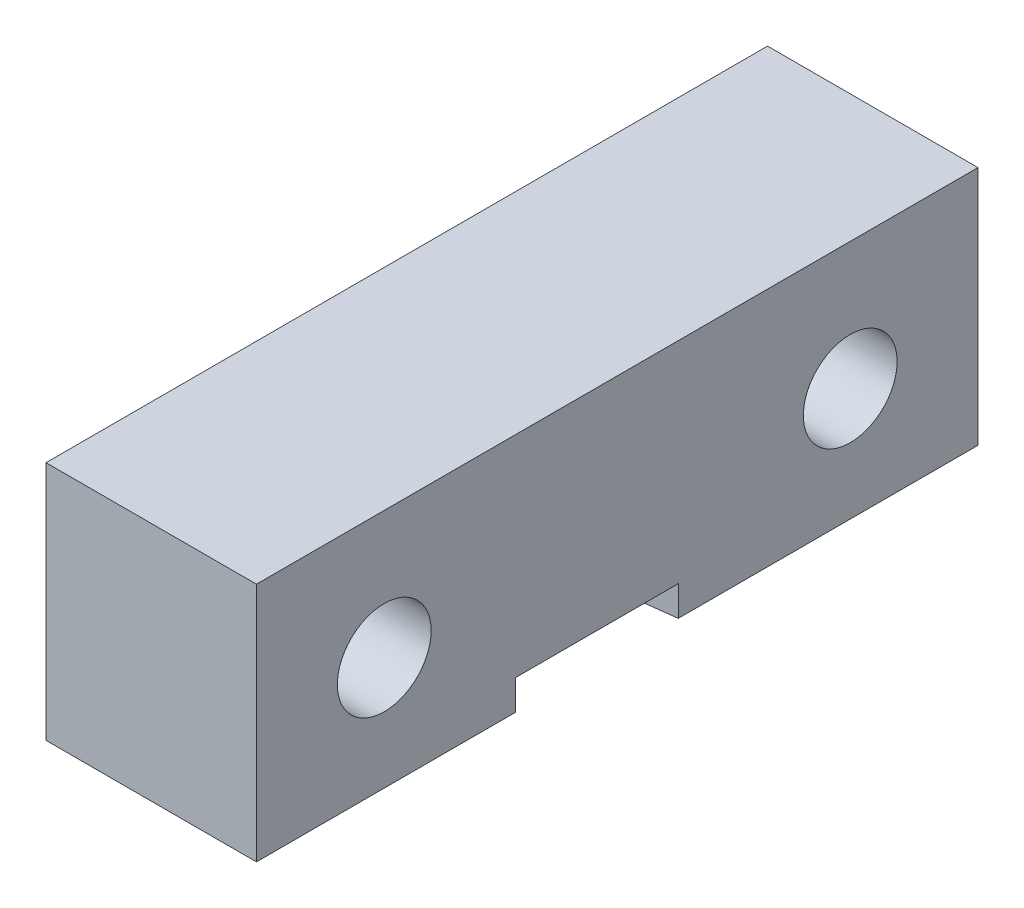
ISO-10303-21;
HEADER;
FILE_DESCRIPTION(('STEP AP214'),'2;1');
FILE_NAME('part.step','',(''),(''),'','','');
FILE_SCHEMA(('AUTOMOTIVE_DESIGN { 1 0 10303 214 1 1 1 1 }'));
ENDSEC;
DATA;
#1=APPLICATION_CONTEXT('core data for automotive mechanical design processes');
#2=APPLICATION_PROTOCOL_DEFINITION('international standard','automotive_design',2000,#1);
#3=PRODUCT_CONTEXT('',#1,'mechanical');
#4=PRODUCT('Part','Part','',(#3));
#5=PRODUCT_RELATED_PRODUCT_CATEGORY('part','',(#4));
#6=PRODUCT_DEFINITION_FORMATION('','',#4);
#7=PRODUCT_DEFINITION_CONTEXT('part definition',#1,'design');
#8=PRODUCT_DEFINITION('design','',#6,#7);
#9=PRODUCT_DEFINITION_SHAPE('','',#8);
#10=(LENGTH_UNIT() NAMED_UNIT(*) SI_UNIT(.MILLI.,.METRE.));
#11=(NAMED_UNIT(*) PLANE_ANGLE_UNIT() SI_UNIT($,.RADIAN.));
#12=(NAMED_UNIT(*) SI_UNIT($,.STERADIAN.) SOLID_ANGLE_UNIT());
#13=UNCERTAINTY_MEASURE_WITH_UNIT(LENGTH_MEASURE(1.E-05),#10,'distance_accuracy_value','');
#14=(GEOMETRIC_REPRESENTATION_CONTEXT(3) GLOBAL_UNCERTAINTY_ASSIGNED_CONTEXT((#13)) GLOBAL_UNIT_ASSIGNED_CONTEXT((#10,
#11,#12)) REPRESENTATION_CONTEXT('',''));
#15=CARTESIAN_POINT('',(0.,0.,0.));
#16=DIRECTION('',(0.,0.,1.));
#17=DIRECTION('',(1.,0.,0.));
#18=AXIS2_PLACEMENT_3D('',#15,#16,#17);
#19=CARTESIAN_POINT('',(-22.226,-1.52399999999999,-49.2125));
#20=DIRECTION('',(1.,0.,0.));
#21=DIRECTION('',(0.,0.,-1.));
#22=AXIS2_PLACEMENT_3D('',#19,#20,#21);
#23=CYLINDRICAL_SURFACE('',#22,6.731);
#24=CARTESIAN_POINT('',(-22.225,-1.52399999999999,-49.2125));
#25=DIRECTION('',(1.,0.,0.));
#26=DIRECTION('',(0.,0.,-1.));
#27=AXIS2_PLACEMENT_3D('',#24,#25,#26);
#28=CIRCLE('',#27,6.731);
#29=CARTESIAN_POINT('',(-22.225,-1.52399999999999,-55.9435));
#30=VERTEX_POINT('',#29);
#31=EDGE_CURVE('E162',#30,#30,#28,.F.);
#32=ORIENTED_EDGE('',*,*,#31,.T.);
#33=EDGE_LOOP('',(#32));
#34=FACE_BOUND('',#33,.T.);
#35=CARTESIAN_POINT('',(-16.383,-1.52399999999999,-49.2125));
#36=DIRECTION('',(1.,0.,0.));
#37=DIRECTION('',(0.,0.,-1.));
#38=AXIS2_PLACEMENT_3D('',#35,#36,#37);
#39=CIRCLE('',#38,6.731);
#40=CARTESIAN_POINT('',(-16.383,-1.52399999999999,-55.9435));
#41=VERTEX_POINT('',#40);
#42=EDGE_CURVE('E46',#41,#41,#39,.F.);
#43=ORIENTED_EDGE('',*,*,#42,.F.);
#44=EDGE_LOOP('',(#43));
#45=FACE_BOUND('',#44,.T.);
#46=ADVANCED_FACE('F42',(#34,#45),#23,.F.);
#47=CARTESIAN_POINT('',(-22.226,-1.52399999999999,49.2125));
#48=DIRECTION('',(1.,0.,0.));
#49=DIRECTION('',(0.,0.,-1.));
#50=AXIS2_PLACEMENT_3D('',#47,#48,#49);
#51=CYLINDRICAL_SURFACE('',#50,6.731);
#52=CARTESIAN_POINT('',(-22.225,-1.52399999999999,49.2125));
#53=DIRECTION('',(1.,0.,0.));
#54=DIRECTION('',(0.,0.,-1.));
#55=AXIS2_PLACEMENT_3D('',#52,#53,#54);
#56=CIRCLE('',#55,6.731);
#57=CARTESIAN_POINT('',(-22.225,-1.52399999999999,42.4815));
#58=VERTEX_POINT('',#57);
#59=EDGE_CURVE('E158',#58,#58,#56,.F.);
#60=ORIENTED_EDGE('',*,*,#59,.T.);
#61=EDGE_LOOP('',(#60));
#62=FACE_BOUND('',#61,.T.);
#63=CARTESIAN_POINT('',(-16.383,-1.52399999999999,49.2125));
#64=DIRECTION('',(1.,0.,0.));
#65=DIRECTION('',(0.,0.,-1.));
#66=AXIS2_PLACEMENT_3D('',#63,#64,#65);
#67=CIRCLE('',#66,6.731);
#68=CARTESIAN_POINT('',(-16.383,-1.52399999999999,42.4815));
#69=VERTEX_POINT('',#68);
#70=EDGE_CURVE('E148',#69,#69,#67,.F.);
#71=ORIENTED_EDGE('',*,*,#70,.F.);
#72=EDGE_LOOP('',(#71));
#73=FACE_BOUND('',#72,.T.);
#74=ADVANCED_FACE('F193',(#62,#73),#51,.F.);
#75=CARTESIAN_POINT('',(-22.225,-25.4,76.2));
#76=DIRECTION('',(1.,0.,0.));
#77=DIRECTION('',(0.,0.,-1.));
#78=AXIS2_PLACEMENT_3D('',#75,#76,#77);
#79=PLANE('',#78);
#80=ORIENTED_EDGE('',*,*,#59,.F.);
#81=EDGE_LOOP('',(#80));
#82=FACE_BOUND('',#81,.T.);
#83=ORIENTED_EDGE('',*,*,#31,.F.);
#84=EDGE_LOOP('',(#83));
#85=FACE_BOUND('',#84,.T.);
#86=DIRECTION('',(0.,-1.,0.));
#87=VECTOR('',#86,1.);
#88=CARTESIAN_POINT('',(-22.225,-25.4,-76.2));
#89=LINE('',#88,#87);
#90=CARTESIAN_POINT('',(-22.225,25.4,-76.2));
#91=VERTEX_POINT('',#90);
#92=CARTESIAN_POINT('',(-22.225,-25.4,-76.2));
#93=VERTEX_POINT('',#92);
#94=EDGE_CURVE('E161',#91,#93,#89,.T.);
#95=ORIENTED_EDGE('',*,*,#94,.T.);
#96=DIRECTION('',(0.,0.,-1.));
#97=VECTOR('',#96,1.);
#98=CARTESIAN_POINT('',(-22.225,-25.4,76.2));
#99=LINE('',#98,#97);
#100=CARTESIAN_POINT('',(-22.225,-25.4,76.2));
#101=VERTEX_POINT('',#100);
#102=EDGE_CURVE('E11',#101,#93,#99,.T.);
#103=ORIENTED_EDGE('',*,*,#102,.F.);
#104=DIRECTION('',(0.,-1.,0.));
#105=VECTOR('',#104,1.);
#106=CARTESIAN_POINT('',(-22.225,-25.4,76.2));
#107=LINE('',#106,#105);
#108=CARTESIAN_POINT('',(-22.225,25.4,76.2));
#109=VERTEX_POINT('',#108);
#110=EDGE_CURVE('E165',#109,#101,#107,.T.);
#111=ORIENTED_EDGE('',*,*,#110,.F.);
#112=DIRECTION('',(0.,0.,-1.));
#113=VECTOR('',#112,1.);
#114=CARTESIAN_POINT('',(-22.225,25.4,76.2));
#115=LINE('',#114,#113);
#116=EDGE_CURVE('E171',#109,#91,#115,.T.);
#117=ORIENTED_EDGE('',*,*,#116,.T.);
#118=EDGE_LOOP('',(#95,#103,#111,#117));
#119=FACE_BOUND('',#118,.T.);
#120=ADVANCED_FACE('F44',(#82,#85,#119),#79,.F.);
#121=CARTESIAN_POINT('',(22.225,-25.4,76.2));
#122=DIRECTION('',(0.,1.,0.));
#123=DIRECTION('',(-1.,0.,0.));
#124=AXIS2_PLACEMENT_3D('',#121,#122,#123);
#125=PLANE('',#124);
#126=DIRECTION('',(0.,0.,-1.));
#127=VECTOR('',#126,1.);
#128=CARTESIAN_POINT('',(22.225,-25.4,76.2));
#129=LINE('',#128,#127);
#130=CARTESIAN_POINT('',(22.225,-25.4,-12.8902412442228));
#131=VERTEX_POINT('',#130);
#132=CARTESIAN_POINT('',(22.225,-25.4,-76.2));
#133=VERTEX_POINT('',#132);
#134=EDGE_CURVE('E183',#131,#133,#129,.T.);
#135=ORIENTED_EDGE('',*,*,#134,.F.);
#136=DIRECTION('',(0.992381216435197,0.,-0.123205199835875));
#137=VECTOR('',#136,1.);
#138=CARTESIAN_POINT('',(22.225,-25.4,-12.8902412442228));
#139=LINE('',#138,#137);
#140=CARTESIAN_POINT('',(0.94724636356612,-25.4,-10.248585149348));
#141=VERTEX_POINT('',#140);
#142=EDGE_CURVE('E226',#141,#131,#139,.T.);
#143=ORIENTED_EDGE('',*,*,#142,.F.);
#144=CARTESIAN_POINT('',(2.75604654339657,-25.4,4.32076196538043));
#145=DIRECTION('',(0.,-1.,0.));
#146=DIRECTION('',(1.,0.,0.));
#147=AXIS2_PLACEMENT_3D('',#144,#145,#146);
#148=CIRCLE('',#147,14.6812);
#149=CARTESIAN_POINT('',(0.947246363566016,-25.4,18.8901090801088));
#150=VERTEX_POINT('',#149);
#151=EDGE_CURVE('E234',#150,#141,#148,.T.);
#152=ORIENTED_EDGE('',*,*,#151,.F.);
#153=DIRECTION('',(-0.992381216435197,0.,-0.123205199835882));
#154=VECTOR('',#153,1.);
#155=CARTESIAN_POINT('',(22.225,-25.4,21.5317651749838));
#156=LINE('',#155,#154);
#157=CARTESIAN_POINT('',(22.225,-25.4,21.5317651749838));
#158=VERTEX_POINT('',#157);
#159=EDGE_CURVE('E232',#158,#150,#156,.T.);
#160=ORIENTED_EDGE('',*,*,#159,.F.);
#161=CARTESIAN_POINT('',(22.225,-25.4,76.2));
#162=VERTEX_POINT('',#161);
#163=EDGE_CURVE('E51',#162,#158,#129,.T.);
#164=ORIENTED_EDGE('',*,*,#163,.F.);
#165=DIRECTION('',(1.,0.,0.));
#166=VECTOR('',#165,1.);
#167=CARTESIAN_POINT('',(22.225,-25.4,76.2));
#168=LINE('',#167,#166);
#169=EDGE_CURVE('E96',#101,#162,#168,.T.);
#170=ORIENTED_EDGE('',*,*,#169,.F.);
#171=ORIENTED_EDGE('',*,*,#102,.T.);
#172=DIRECTION('',(1.,0.,0.));
#173=VECTOR('',#172,1.);
#174=CARTESIAN_POINT('',(22.225,-25.4,-76.2));
#175=LINE('',#174,#173);
#176=EDGE_CURVE('E174',#93,#133,#175,.T.);
#177=ORIENTED_EDGE('',*,*,#176,.T.);
#178=EDGE_LOOP('',(#135,#143,#152,#160,#164,#170,#171,#177));
#179=FACE_BOUND('',#178,.T.);
#180=ADVANCED_FACE('F215',(#179),#125,.F.);
#181=CARTESIAN_POINT('',(22.225,-25.4,76.2));
#182=DIRECTION('',(-1.,0.,0.));
#183=DIRECTION('',(0.,0.,1.));
#184=AXIS2_PLACEMENT_3D('',#181,#182,#183);
#185=PLANE('',#184);
#186=CARTESIAN_POINT('',(22.225,-1.52399999999999,49.2125));
#187=DIRECTION('',(1.,0.,0.));
#188=DIRECTION('',(0.,0.,-1.));
#189=AXIS2_PLACEMENT_3D('',#186,#187,#188);
#190=CIRCLE('',#189,9.906);
#191=CARTESIAN_POINT('',(22.225,-1.52399999999999,39.3065));
#192=VERTEX_POINT('',#191);
#193=EDGE_CURVE('E149',#192,#192,#190,.T.);
#194=ORIENTED_EDGE('',*,*,#193,.F.);
#195=EDGE_LOOP('',(#194));
#196=FACE_BOUND('',#195,.T.);
#197=CARTESIAN_POINT('',(22.225,-1.52399999999999,-49.2125));
#198=DIRECTION('',(1.,0.,0.));
#199=DIRECTION('',(0.,0.,-1.));
#200=AXIS2_PLACEMENT_3D('',#197,#198,#199);
#201=CIRCLE('',#200,9.906);
#202=CARTESIAN_POINT('',(22.225,-1.52399999999999,-59.1185));
#203=VERTEX_POINT('',#202);
#204=EDGE_CURVE('E152',#203,#203,#201,.T.);
#205=ORIENTED_EDGE('',*,*,#204,.F.);
#206=EDGE_LOOP('',(#205));
#207=FACE_BOUND('',#206,.T.);
#208=DIRECTION('',(0.,0.,1.));
#209=VECTOR('',#208,1.);
#210=CARTESIAN_POINT('',(22.225,-19.05,-12.8902412442228));
#211=LINE('',#210,#209);
#212=CARTESIAN_POINT('',(22.225,-19.05,-12.8902412442228));
#213=VERTEX_POINT('',#212);
#214=CARTESIAN_POINT('',(22.225,-19.05,21.5317651749838));
#215=VERTEX_POINT('',#214);
#216=EDGE_CURVE('E128',#213,#215,#211,.T.);
#217=ORIENTED_EDGE('',*,*,#216,.F.);
#218=DIRECTION('',(0.,-1.,0.));
#219=VECTOR('',#218,1.);
#220=CARTESIAN_POINT('',(22.225,-19.05,-12.8902412442228));
#221=LINE('',#220,#219);
#222=EDGE_CURVE('E138',#213,#131,#221,.T.);
#223=ORIENTED_EDGE('',*,*,#222,.T.);
#224=ORIENTED_EDGE('',*,*,#134,.T.);
#225=DIRECTION('',(0.,1.,0.));
#226=VECTOR('',#225,1.);
#227=CARTESIAN_POINT('',(22.225,-25.4,-76.2));
#228=LINE('',#227,#226);
#229=CARTESIAN_POINT('',(22.225,25.4,-76.2));
#230=VERTEX_POINT('',#229);
#231=EDGE_CURVE('E177',#133,#230,#228,.T.);
#232=ORIENTED_EDGE('',*,*,#231,.T.);
#233=DIRECTION('',(0.,0.,-1.));
#234=VECTOR('',#233,1.);
#235=CARTESIAN_POINT('',(22.225,25.4,76.2));
#236=LINE('',#235,#234);
#237=CARTESIAN_POINT('',(22.225,25.4,76.2));
#238=VERTEX_POINT('',#237);
#239=EDGE_CURVE('E181',#238,#230,#236,.T.);
#240=ORIENTED_EDGE('',*,*,#239,.F.);
#241=DIRECTION('',(0.,1.,0.));
#242=VECTOR('',#241,1.);
#243=CARTESIAN_POINT('',(22.225,-25.4,76.2));
#244=LINE('',#243,#242);
#245=EDGE_CURVE('E168',#162,#238,#244,.T.);
#246=ORIENTED_EDGE('',*,*,#245,.F.);
#247=ORIENTED_EDGE('',*,*,#163,.T.);
#248=DIRECTION('',(0.,-1.,0.));
#249=VECTOR('',#248,1.);
#250=CARTESIAN_POINT('',(22.225,-19.05,21.5317651749838));
#251=LINE('',#250,#249);
#252=EDGE_CURVE('E123',#215,#158,#251,.T.);
#253=ORIENTED_EDGE('',*,*,#252,.F.);
#254=EDGE_LOOP('',(#217,#223,#224,#232,#240,#246,#247,#253));
#255=FACE_BOUND('',#254,.T.);
#256=ADVANCED_FACE('F136',(#196,#207,#255),#185,.F.);
#257=CARTESIAN_POINT('',(22.225,25.4,76.2));
#258=DIRECTION('',(0.,-1.,0.));
#259=DIRECTION('',(1.,0.,0.));
#260=AXIS2_PLACEMENT_3D('',#257,#258,#259);
#261=PLANE('',#260);
#262=DIRECTION('',(-1.,0.,0.));
#263=VECTOR('',#262,1.);
#264=CARTESIAN_POINT('',(22.225,25.4,-76.2));
#265=LINE('',#264,#263);
#266=EDGE_CURVE('E89',#230,#91,#265,.T.);
#267=ORIENTED_EDGE('',*,*,#266,.T.);
#268=ORIENTED_EDGE('',*,*,#116,.F.);
#269=DIRECTION('',(-1.,0.,0.));
#270=VECTOR('',#269,1.);
#271=CARTESIAN_POINT('',(22.225,25.4,76.2));
#272=LINE('',#271,#270);
#273=EDGE_CURVE('E68',#238,#109,#272,.T.);
#274=ORIENTED_EDGE('',*,*,#273,.F.);
#275=ORIENTED_EDGE('',*,*,#239,.T.);
#276=EDGE_LOOP('',(#267,#268,#274,#275));
#277=FACE_BOUND('',#276,.T.);
#278=ADVANCED_FACE('F207',(#277),#261,.F.);
#279=CARTESIAN_POINT('',(0.,0.,76.2));
#280=DIRECTION('',(0.,0.,1.));
#281=DIRECTION('',(1.,0.,0.));
#282=AXIS2_PLACEMENT_3D('',#279,#280,#281);
#283=PLANE('',#282);
#284=ORIENTED_EDGE('',*,*,#110,.T.);
#285=ORIENTED_EDGE('',*,*,#169,.T.);
#286=ORIENTED_EDGE('',*,*,#245,.T.);
#287=ORIENTED_EDGE('',*,*,#273,.T.);
#288=EDGE_LOOP('',(#284,#285,#286,#287));
#289=FACE_BOUND('',#288,.T.);
#290=ADVANCED_FACE('F203',(#289),#283,.T.);
#291=CARTESIAN_POINT('',(0.,0.,-76.2));
#292=DIRECTION('',(0.,0.,1.));
#293=DIRECTION('',(1.,0.,0.));
#294=AXIS2_PLACEMENT_3D('',#291,#292,#293);
#295=PLANE('',#294);
#296=ORIENTED_EDGE('',*,*,#94,.F.);
#297=ORIENTED_EDGE('',*,*,#266,.F.);
#298=ORIENTED_EDGE('',*,*,#231,.F.);
#299=ORIENTED_EDGE('',*,*,#176,.F.);
#300=EDGE_LOOP('',(#296,#297,#298,#299));
#301=FACE_BOUND('',#300,.T.);
#302=ADVANCED_FACE('F206',(#301),#295,.F.);
#303=CARTESIAN_POINT('',(-16.383,-1.52399999999999,49.2125));
#304=DIRECTION('',(1.,0.,0.));
#305=DIRECTION('',(0.,0.,-1.));
#306=AXIS2_PLACEMENT_3D('',#303,#304,#305);
#307=PLANE('',#306);
#308=CARTESIAN_POINT('',(-16.383,-1.52399999999999,49.2125));
#309=DIRECTION('',(1.,0.,0.));
#310=DIRECTION('',(0.,0.,-1.));
#311=AXIS2_PLACEMENT_3D('',#308,#309,#310);
#312=CIRCLE('',#311,9.906);
#313=CARTESIAN_POINT('',(-16.383,-1.52399999999999,39.3065));
#314=VERTEX_POINT('',#313);
#315=EDGE_CURVE('E145',#314,#314,#312,.T.);
#316=ORIENTED_EDGE('',*,*,#315,.T.);
#317=EDGE_LOOP('',(#316));
#318=FACE_BOUND('',#317,.T.);
#319=ORIENTED_EDGE('',*,*,#70,.T.);
#320=EDGE_LOOP('',(#319));
#321=FACE_BOUND('',#320,.T.);
#322=ADVANCED_FACE('F210',(#318,#321),#307,.T.);
#323=CARTESIAN_POINT('',(-16.383,-1.52399999999999,49.2125));
#324=DIRECTION('',(1.,0.,0.));
#325=DIRECTION('',(0.,0.,-1.));
#326=AXIS2_PLACEMENT_3D('',#323,#324,#325);
#327=CYLINDRICAL_SURFACE('',#326,9.906);
#328=ORIENTED_EDGE('',*,*,#315,.F.);
#329=EDGE_LOOP('',(#328));
#330=FACE_BOUND('',#329,.T.);
#331=ORIENTED_EDGE('',*,*,#193,.T.);
#332=EDGE_LOOP('',(#331));
#333=FACE_BOUND('',#332,.T.);
#334=ADVANCED_FACE('F258',(#330,#333),#327,.F.);
#335=CARTESIAN_POINT('',(-16.383,-1.52399999999999,-49.2125));
#336=DIRECTION('',(1.,0.,0.));
#337=DIRECTION('',(0.,0.,-1.));
#338=AXIS2_PLACEMENT_3D('',#335,#336,#337);
#339=PLANE('',#338);
#340=CARTESIAN_POINT('',(-16.383,-1.52399999999999,-49.2125));
#341=DIRECTION('',(1.,0.,0.));
#342=DIRECTION('',(0.,0.,-1.));
#343=AXIS2_PLACEMENT_3D('',#340,#341,#342);
#344=CIRCLE('',#343,9.906);
#345=CARTESIAN_POINT('',(-16.383,-1.52399999999999,-59.1185));
#346=VERTEX_POINT('',#345);
#347=EDGE_CURVE('E155',#346,#346,#344,.T.);
#348=ORIENTED_EDGE('',*,*,#347,.T.);
#349=EDGE_LOOP('',(#348));
#350=FACE_BOUND('',#349,.T.);
#351=ORIENTED_EDGE('',*,*,#42,.T.);
#352=EDGE_LOOP('',(#351));
#353=FACE_BOUND('',#352,.T.);
#354=ADVANCED_FACE('F190',(#350,#353),#339,.T.);
#355=CARTESIAN_POINT('',(-16.383,-1.52399999999999,-49.2125));
#356=DIRECTION('',(1.,0.,0.));
#357=DIRECTION('',(0.,0.,-1.));
#358=AXIS2_PLACEMENT_3D('',#355,#356,#357);
#359=CYLINDRICAL_SURFACE('',#358,9.906);
#360=ORIENTED_EDGE('',*,*,#347,.F.);
#361=EDGE_LOOP('',(#360));
#362=FACE_BOUND('',#361,.T.);
#363=ORIENTED_EDGE('',*,*,#204,.T.);
#364=EDGE_LOOP('',(#363));
#365=FACE_BOUND('',#364,.T.);
#366=ADVANCED_FACE('F252',(#362,#365),#359,.F.);
#367=CARTESIAN_POINT('',(22.225,-19.05,-12.8902412442228));
#368=DIRECTION('',(-0.123205199835875,0.,-0.992381216435197));
#369=DIRECTION('',(-0.992381216435198,0.,0.123205199835875));
#370=AXIS2_PLACEMENT_3D('',#367,#368,#369);
#371=PLANE('',#370);
#372=ORIENTED_EDGE('',*,*,#142,.T.);
#373=ORIENTED_EDGE('',*,*,#222,.F.);
#374=DIRECTION('',(0.992381216435197,0.,-0.123205199835875));
#375=VECTOR('',#374,1.);
#376=CARTESIAN_POINT('',(22.225,-19.05,-12.8902412442228));
#377=LINE('',#376,#375);
#378=CARTESIAN_POINT('',(0.947246363566119,-19.05,-10.248585149348));
#379=VERTEX_POINT('',#378);
#380=EDGE_CURVE('E59',#379,#213,#377,.T.);
#381=ORIENTED_EDGE('',*,*,#380,.F.);
#382=DIRECTION('',(0.,-1.,0.));
#383=VECTOR('',#382,1.);
#384=CARTESIAN_POINT('',(0.947246363566119,-19.05,-10.248585149348));
#385=LINE('',#384,#383);
#386=EDGE_CURVE('E140',#379,#141,#385,.T.);
#387=ORIENTED_EDGE('',*,*,#386,.T.);
#388=EDGE_LOOP('',(#372,#373,#381,#387));
#389=FACE_BOUND('',#388,.T.);
#390=ADVANCED_FACE('F230',(#389),#371,.F.);
#391=CARTESIAN_POINT('',(2.75604654339657,-19.05,4.32076196538043));
#392=DIRECTION('',(0.,-1.,0.));
#393=DIRECTION('',(1.,0.,0.));
#394=AXIS2_PLACEMENT_3D('',#391,#392,#393);
#395=CYLINDRICAL_SURFACE('',#394,14.6812);
#396=ORIENTED_EDGE('',*,*,#151,.T.);
#397=ORIENTED_EDGE('',*,*,#386,.F.);
#398=CARTESIAN_POINT('',(2.75604654339657,-19.05,4.32076196538043));
#399=DIRECTION('',(0.,-1.,0.));
#400=DIRECTION('',(1.,0.,0.));
#401=AXIS2_PLACEMENT_3D('',#398,#399,#400);
#402=CIRCLE('',#401,14.6812);
#403=CARTESIAN_POINT('',(0.947246363566015,-19.05,18.8901090801088));
#404=VERTEX_POINT('',#403);
#405=EDGE_CURVE('E127',#404,#379,#402,.T.);
#406=ORIENTED_EDGE('',*,*,#405,.F.);
#407=DIRECTION('',(0.,-1.,0.));
#408=VECTOR('',#407,1.);
#409=CARTESIAN_POINT('',(0.947246363566015,-19.05,18.8901090801088));
#410=LINE('',#409,#408);
#411=EDGE_CURVE('E125',#404,#150,#410,.T.);
#412=ORIENTED_EDGE('',*,*,#411,.T.);
#413=EDGE_LOOP('',(#396,#397,#406,#412));
#414=FACE_BOUND('',#413,.T.);
#415=ADVANCED_FACE('F240',(#414),#395,.F.);
#416=CARTESIAN_POINT('',(22.225,-19.05,21.5317651749838));
#417=DIRECTION('',(-0.123205199835882,0.,0.992381216435196));
#418=DIRECTION('',(0.992381216435197,0.,0.123205199835882));
#419=AXIS2_PLACEMENT_3D('',#416,#417,#418);
#420=PLANE('',#419);
#421=ORIENTED_EDGE('',*,*,#159,.T.);
#422=ORIENTED_EDGE('',*,*,#411,.F.);
#423=DIRECTION('',(-0.992381216435197,0.,-0.123205199835882));
#424=VECTOR('',#423,1.);
#425=CARTESIAN_POINT('',(22.225,-19.05,21.5317651749838));
#426=LINE('',#425,#424);
#427=EDGE_CURVE('E119',#215,#404,#426,.T.);
#428=ORIENTED_EDGE('',*,*,#427,.F.);
#429=ORIENTED_EDGE('',*,*,#252,.T.);
#430=EDGE_LOOP('',(#421,#422,#428,#429));
#431=FACE_BOUND('',#430,.T.);
#432=ADVANCED_FACE('F121',(#431),#420,.F.);
#433=CARTESIAN_POINT('',(2.75604654339657,-19.05,4.32076196538043));
#434=DIRECTION('',(0.,-1.,0.));
#435=DIRECTION('',(1.,0.,0.));
#436=AXIS2_PLACEMENT_3D('',#433,#434,#435);
#437=PLANE('',#436);
#438=ORIENTED_EDGE('',*,*,#380,.T.);
#439=ORIENTED_EDGE('',*,*,#216,.T.);
#440=ORIENTED_EDGE('',*,*,#427,.T.);
#441=ORIENTED_EDGE('',*,*,#405,.T.);
#442=EDGE_LOOP('',(#438,#439,#440,#441));
#443=FACE_BOUND('',#442,.T.);
#444=ADVANCED_FACE('F131',(#443),#437,.T.);
#445=CLOSED_SHELL('',(#46,#74,#120,#180,#256,#278,#290,#302,#322,#334,#354,#366,#390,#415,#432,#444));
#446=MANIFOLD_SOLID_BREP('B2',#445);
#447=ADVANCED_BREP_SHAPE_REPRESENTATION('',(#18,#446),#14);
#448=SHAPE_DEFINITION_REPRESENTATION(#9,#447);
ENDSEC;
END-ISO-10303-21;
